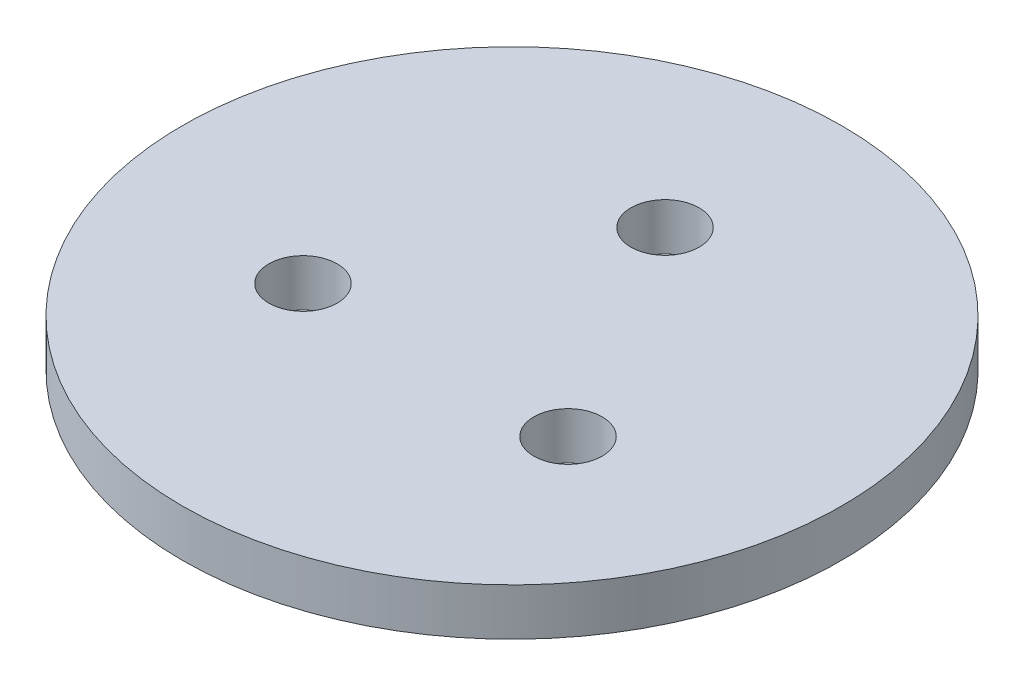
ISO-10303-21;
HEADER;
FILE_DESCRIPTION(('STEP AP214'),'2;1');
FILE_NAME('part.step','',(''),(''),'','','');
FILE_SCHEMA(('AUTOMOTIVE_DESIGN { 1 0 10303 214 1 1 1 1 }'));
ENDSEC;
DATA;
#1=APPLICATION_CONTEXT('core data for automotive mechanical design processes');
#2=APPLICATION_PROTOCOL_DEFINITION('international standard','automotive_design',2000,#1);
#3=PRODUCT_CONTEXT('',#1,'mechanical');
#4=PRODUCT('Part','Part','',(#3));
#5=PRODUCT_RELATED_PRODUCT_CATEGORY('part','',(#4));
#6=PRODUCT_DEFINITION_FORMATION('','',#4);
#7=PRODUCT_DEFINITION_CONTEXT('part definition',#1,'design');
#8=PRODUCT_DEFINITION('design','',#6,#7);
#9=PRODUCT_DEFINITION_SHAPE('','',#8);
#10=(LENGTH_UNIT() NAMED_UNIT(*) SI_UNIT(.MILLI.,.METRE.));
#11=(NAMED_UNIT(*) PLANE_ANGLE_UNIT() SI_UNIT($,.RADIAN.));
#12=(NAMED_UNIT(*) SI_UNIT($,.STERADIAN.) SOLID_ANGLE_UNIT());
#13=UNCERTAINTY_MEASURE_WITH_UNIT(LENGTH_MEASURE(1.E-05),#10,'distance_accuracy_value','');
#14=(GEOMETRIC_REPRESENTATION_CONTEXT(3) GLOBAL_UNCERTAINTY_ASSIGNED_CONTEXT((#13)) GLOBAL_UNIT_ASSIGNED_CONTEXT((#10,
#11,#12)) REPRESENTATION_CONTEXT('',''));
#15=CARTESIAN_POINT('',(0.,0.,0.));
#16=DIRECTION('',(0.,0.,1.));
#17=DIRECTION('',(1.,0.,0.));
#18=AXIS2_PLACEMENT_3D('',#15,#16,#17);
#19=CARTESIAN_POINT('',(0.,1.,0.));
#20=DIRECTION('',(0.,-1.,0.));
#21=DIRECTION('',(0.,0.,-1.));
#22=AXIS2_PLACEMENT_3D('',#19,#20,#21);
#23=CYLINDRICAL_SURFACE('',#22,14.);
#24=CARTESIAN_POINT('',(0.,1.,0.));
#25=DIRECTION('',(0.,1.,0.));
#26=DIRECTION('',(0.,0.,1.));
#27=AXIS2_PLACEMENT_3D('',#24,#25,#26);
#28=CIRCLE('',#27,14.);
#29=CARTESIAN_POINT('',(0.,1.,14.));
#30=VERTEX_POINT('',#29);
#31=EDGE_CURVE('E10',#30,#30,#28,.T.);
#32=ORIENTED_EDGE('',*,*,#31,.F.);
#33=EDGE_LOOP('',(#32));
#34=FACE_BOUND('',#33,.T.);
#35=CARTESIAN_POINT('',(0.,-1.,0.));
#36=DIRECTION('',(0.,1.,0.));
#37=DIRECTION('',(0.,0.,1.));
#38=AXIS2_PLACEMENT_3D('',#35,#36,#37);
#39=CIRCLE('',#38,14.);
#40=CARTESIAN_POINT('',(0.,-1.,14.));
#41=VERTEX_POINT('',#40);
#42=EDGE_CURVE('E33',#41,#41,#39,.T.);
#43=ORIENTED_EDGE('',*,*,#42,.T.);
#44=EDGE_LOOP('',(#43));
#45=FACE_BOUND('',#44,.T.);
#46=ADVANCED_FACE('F30',(#34,#45),#23,.T.);
#47=CARTESIAN_POINT('',(0.,1.,0.));
#48=DIRECTION('',(0.,1.,0.));
#49=DIRECTION('',(0.,0.,1.));
#50=AXIS2_PLACEMENT_3D('',#47,#48,#49);
#51=PLANE('',#50);
#52=CARTESIAN_POINT('',(-5.62916512459888,1.,3.24999999999995));
#53=DIRECTION('',(0.,1.,0.));
#54=DIRECTION('',(0.,0.,1.));
#55=AXIS2_PLACEMENT_3D('',#52,#53,#54);
#56=CIRCLE('',#55,1.44999999999999);
#57=CARTESIAN_POINT('',(-5.62916512459888,1.,4.69999999999994));
#58=VERTEX_POINT('',#57);
#59=EDGE_CURVE('E56',#58,#58,#56,.T.);
#60=ORIENTED_EDGE('',*,*,#59,.F.);
#61=EDGE_LOOP('',(#60));
#62=FACE_BOUND('',#61,.T.);
#63=CARTESIAN_POINT('',(5.62916512459884,1.,3.25000000000003));
#64=DIRECTION('',(0.,1.,0.));
#65=DIRECTION('',(0.,0.,1.));
#66=AXIS2_PLACEMENT_3D('',#63,#64,#65);
#67=CIRCLE('',#66,1.44999999999999);
#68=CARTESIAN_POINT('',(5.62916512459884,1.,4.70000000000002));
#69=VERTEX_POINT('',#68);
#70=EDGE_CURVE('E50',#69,#69,#67,.T.);
#71=ORIENTED_EDGE('',*,*,#70,.F.);
#72=EDGE_LOOP('',(#71));
#73=FACE_BOUND('',#72,.T.);
#74=CARTESIAN_POINT('',(0.,1.,-6.5));
#75=DIRECTION('',(0.,1.,0.));
#76=DIRECTION('',(0.,0.,1.));
#77=AXIS2_PLACEMENT_3D('',#74,#75,#76);
#78=CIRCLE('',#77,1.44999999999999);
#79=CARTESIAN_POINT('',(0.,1.,-5.05000000000001));
#80=VERTEX_POINT('',#79);
#81=EDGE_CURVE('E44',#80,#80,#78,.T.);
#82=ORIENTED_EDGE('',*,*,#81,.F.);
#83=EDGE_LOOP('',(#82));
#84=FACE_BOUND('',#83,.T.);
#85=ORIENTED_EDGE('',*,*,#31,.T.);
#86=EDGE_LOOP('',(#85));
#87=FACE_BOUND('',#86,.T.);
#88=ADVANCED_FACE('F62',(#62,#73,#84,#87),#51,.T.);
#89=CARTESIAN_POINT('',(0.,-1.,0.));
#90=DIRECTION('',(0.,1.,0.));
#91=DIRECTION('',(0.,0.,1.));
#92=AXIS2_PLACEMENT_3D('',#89,#90,#91);
#93=PLANE('',#92);
#94=CARTESIAN_POINT('',(-5.62916512459888,-1.,3.24999999999995));
#95=DIRECTION('',(0.,1.,0.));
#96=DIRECTION('',(0.,0.,1.));
#97=AXIS2_PLACEMENT_3D('',#94,#95,#96);
#98=CIRCLE('',#97,1.45);
#99=CARTESIAN_POINT('',(-5.62916512459888,-1.,4.69999999999995));
#100=VERTEX_POINT('',#99);
#101=EDGE_CURVE('E53',#100,#100,#98,.T.);
#102=ORIENTED_EDGE('',*,*,#101,.T.);
#103=EDGE_LOOP('',(#102));
#104=FACE_BOUND('',#103,.T.);
#105=CARTESIAN_POINT('',(5.62916512459884,-1.,3.25000000000003));
#106=DIRECTION('',(0.,1.,0.));
#107=DIRECTION('',(0.,0.,1.));
#108=AXIS2_PLACEMENT_3D('',#105,#106,#107);
#109=CIRCLE('',#108,1.45);
#110=CARTESIAN_POINT('',(5.62916512459884,-1.,4.70000000000003));
#111=VERTEX_POINT('',#110);
#112=EDGE_CURVE('E47',#111,#111,#109,.T.);
#113=ORIENTED_EDGE('',*,*,#112,.T.);
#114=EDGE_LOOP('',(#113));
#115=FACE_BOUND('',#114,.T.);
#116=CARTESIAN_POINT('',(0.,-1.,-6.5));
#117=DIRECTION('',(0.,1.,0.));
#118=DIRECTION('',(0.,0.,1.));
#119=AXIS2_PLACEMENT_3D('',#116,#117,#118);
#120=CIRCLE('',#119,1.45);
#121=CARTESIAN_POINT('',(0.,-1.,-5.05));
#122=VERTEX_POINT('',#121);
#123=EDGE_CURVE('E40',#122,#122,#120,.T.);
#124=ORIENTED_EDGE('',*,*,#123,.T.);
#125=EDGE_LOOP('',(#124));
#126=FACE_BOUND('',#125,.T.);
#127=ORIENTED_EDGE('',*,*,#42,.F.);
#128=EDGE_LOOP('',(#127));
#129=FACE_BOUND('',#128,.T.);
#130=ADVANCED_FACE('F65',(#104,#115,#126,#129),#93,.F.);
#131=CARTESIAN_POINT('',(0.,1.,-6.5));
#132=DIRECTION('',(0.,1.,0.));
#133=DIRECTION('',(0.,0.,1.));
#134=AXIS2_PLACEMENT_3D('',#131,#132,#133);
#135=CYLINDRICAL_SURFACE('',#134,1.44999999999999);
#136=ORIENTED_EDGE('',*,*,#123,.F.);
#137=EDGE_LOOP('',(#136));
#138=FACE_BOUND('',#137,.T.);
#139=ORIENTED_EDGE('',*,*,#81,.T.);
#140=EDGE_LOOP('',(#139));
#141=FACE_BOUND('',#140,.T.);
#142=ADVANCED_FACE('F71',(#138,#141),#135,.F.);
#143=CARTESIAN_POINT('',(5.62916512459884,1.,3.25000000000003));
#144=DIRECTION('',(0.,1.,0.));
#145=DIRECTION('',(0.,0.,1.));
#146=AXIS2_PLACEMENT_3D('',#143,#144,#145);
#147=CYLINDRICAL_SURFACE('',#146,1.44999999999999);
#148=ORIENTED_EDGE('',*,*,#112,.F.);
#149=EDGE_LOOP('',(#148));
#150=FACE_BOUND('',#149,.T.);
#151=ORIENTED_EDGE('',*,*,#70,.T.);
#152=EDGE_LOOP('',(#151));
#153=FACE_BOUND('',#152,.T.);
#154=ADVANCED_FACE('F73',(#150,#153),#147,.F.);
#155=CARTESIAN_POINT('',(-5.62916512459888,1.,3.24999999999995));
#156=DIRECTION('',(0.,1.,0.));
#157=DIRECTION('',(0.,0.,1.));
#158=AXIS2_PLACEMENT_3D('',#155,#156,#157);
#159=CYLINDRICAL_SURFACE('',#158,1.44999999999999);
#160=ORIENTED_EDGE('',*,*,#101,.F.);
#161=EDGE_LOOP('',(#160));
#162=FACE_BOUND('',#161,.T.);
#163=ORIENTED_EDGE('',*,*,#59,.T.);
#164=EDGE_LOOP('',(#163));
#165=FACE_BOUND('',#164,.T.);
#166=ADVANCED_FACE('F60',(#162,#165),#159,.F.);
#167=CLOSED_SHELL('',(#46,#88,#130,#142,#154,#166));
#168=MANIFOLD_SOLID_BREP('B2',#167);
#169=ADVANCED_BREP_SHAPE_REPRESENTATION('',(#18,#168),#14);
#170=SHAPE_DEFINITION_REPRESENTATION(#9,#169);
ENDSEC;
END-ISO-10303-21;
